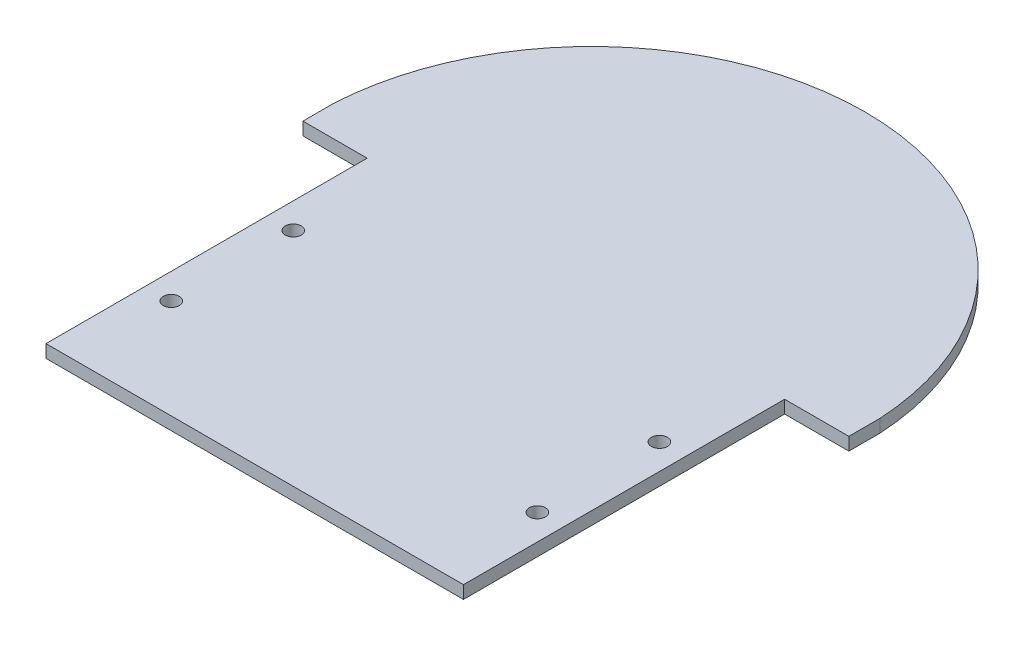
ISO-10303-21;
HEADER;
FILE_DESCRIPTION(('STEP AP214'),'2;1');
FILE_NAME('part.step','',(''),(''),'','','');
FILE_SCHEMA(('AUTOMOTIVE_DESIGN { 1 0 10303 214 1 1 1 1 }'));
ENDSEC;
DATA;
#1=APPLICATION_CONTEXT('core data for automotive mechanical design processes');
#2=APPLICATION_PROTOCOL_DEFINITION('international standard','automotive_design',2000,#1);
#3=PRODUCT_CONTEXT('',#1,'mechanical');
#4=PRODUCT('Part','Part','',(#3));
#5=PRODUCT_RELATED_PRODUCT_CATEGORY('part','',(#4));
#6=PRODUCT_DEFINITION_FORMATION('','',#4);
#7=PRODUCT_DEFINITION_CONTEXT('part definition',#1,'design');
#8=PRODUCT_DEFINITION('design','',#6,#7);
#9=PRODUCT_DEFINITION_SHAPE('','',#8);
#10=(LENGTH_UNIT() NAMED_UNIT(*) SI_UNIT(.MILLI.,.METRE.));
#11=(NAMED_UNIT(*) PLANE_ANGLE_UNIT() SI_UNIT($,.RADIAN.));
#12=(NAMED_UNIT(*) SI_UNIT($,.STERADIAN.) SOLID_ANGLE_UNIT());
#13=UNCERTAINTY_MEASURE_WITH_UNIT(LENGTH_MEASURE(1.E-05),#10,'distance_accuracy_value','');
#14=(GEOMETRIC_REPRESENTATION_CONTEXT(3) GLOBAL_UNCERTAINTY_ASSIGNED_CONTEXT((#13)) GLOBAL_UNIT_ASSIGNED_CONTEXT((#10,
#11,#12)) REPRESENTATION_CONTEXT('',''));
#15=CARTESIAN_POINT('',(0.,0.,0.));
#16=DIRECTION('',(0.,0.,1.));
#17=DIRECTION('',(1.,0.,0.));
#18=AXIS2_PLACEMENT_3D('',#15,#16,#17);
#19=CARTESIAN_POINT('',(0.,2.,-4.93055555555554));
#20=DIRECTION('',(0.,-1.,0.));
#21=DIRECTION('',(0.,0.,-1.));
#22=AXIS2_PLACEMENT_3D('',#19,#20,#21);
#23=CYLINDRICAL_SURFACE('',#22,42.5694444444444);
#24=CARTESIAN_POINT('',(0.,0.,-4.93055555555554));
#25=DIRECTION('',(0.,1.,0.));
#26=DIRECTION('',(0.,0.,1.));
#27=AXIS2_PLACEMENT_3D('',#24,#25,#26);
#28=CIRCLE('',#27,42.5694444444444);
#29=CARTESIAN_POINT('',(-42.5,0.,-7.36111111111103));
#30=VERTEX_POINT('',#29);
#31=CARTESIAN_POINT('',(42.5,0.,-7.36111111111103));
#32=VERTEX_POINT('',#31);
#33=EDGE_CURVE('E139',#30,#32,#28,.F.);
#34=ORIENTED_EDGE('',*,*,#33,.F.);
#35=DIRECTION('',(0.,-1.,0.));
#36=VECTOR('',#35,1.);
#37=CARTESIAN_POINT('',(-42.5,2.,-7.36111111111103));
#38=LINE('',#37,#36);
#39=CARTESIAN_POINT('',(-42.5,2.,-7.36111111111103));
#40=VERTEX_POINT('',#39);
#41=EDGE_CURVE('E11',#40,#30,#38,.T.);
#42=ORIENTED_EDGE('',*,*,#41,.F.);
#43=CARTESIAN_POINT('',(0.,2.,-4.93055555555554));
#44=DIRECTION('',(0.,1.,0.));
#45=DIRECTION('',(0.,0.,1.));
#46=AXIS2_PLACEMENT_3D('',#43,#44,#45);
#47=CIRCLE('',#46,42.5694444444444);
#48=CARTESIAN_POINT('',(42.5,2.,-7.36111111111103));
#49=VERTEX_POINT('',#48);
#50=EDGE_CURVE('E159',#40,#49,#47,.F.);
#51=ORIENTED_EDGE('',*,*,#50,.T.);
#52=DIRECTION('',(0.,-1.,0.));
#53=VECTOR('',#52,1.);
#54=CARTESIAN_POINT('',(42.5,2.,-7.36111111111103));
#55=LINE('',#54,#53);
#56=EDGE_CURVE('E95',#49,#32,#55,.T.);
#57=ORIENTED_EDGE('',*,*,#56,.T.);
#58=EDGE_LOOP('',(#34,#42,#51,#57));
#59=FACE_BOUND('',#58,.T.);
#60=ADVANCED_FACE('F45',(#59),#23,.T.);
#61=CARTESIAN_POINT('',(-42.5,2.,0.));
#62=DIRECTION('',(-1.,0.,0.));
#63=DIRECTION('',(0.,0.,1.));
#64=AXIS2_PLACEMENT_3D('',#61,#62,#63);
#65=PLANE('',#64);
#66=DIRECTION('',(0.,0.,-1.));
#67=VECTOR('',#66,1.);
#68=CARTESIAN_POINT('',(-42.5,0.,0.));
#69=LINE('',#68,#67);
#70=CARTESIAN_POINT('',(-42.5,0.,-2.50000000000001));
#71=VERTEX_POINT('',#70);
#72=EDGE_CURVE('E142',#71,#30,#69,.T.);
#73=ORIENTED_EDGE('',*,*,#72,.F.);
#74=DIRECTION('',(0.,-1.,0.));
#75=VECTOR('',#74,1.);
#76=CARTESIAN_POINT('',(-42.5,2.,-2.50000000000001));
#77=LINE('',#76,#75);
#78=CARTESIAN_POINT('',(-42.5,2.,-2.50000000000001));
#79=VERTEX_POINT('',#78);
#80=EDGE_CURVE('E53',#79,#71,#77,.T.);
#81=ORIENTED_EDGE('',*,*,#80,.F.);
#82=DIRECTION('',(0.,0.,-1.));
#83=VECTOR('',#82,1.);
#84=CARTESIAN_POINT('',(-42.5,2.,0.));
#85=LINE('',#84,#83);
#86=EDGE_CURVE('E181',#79,#40,#85,.T.);
#87=ORIENTED_EDGE('',*,*,#86,.T.);
#88=ORIENTED_EDGE('',*,*,#41,.T.);
#89=EDGE_LOOP('',(#73,#81,#87,#88));
#90=FACE_BOUND('',#89,.T.);
#91=ADVANCED_FACE('F180',(#90),#65,.T.);
#92=CARTESIAN_POINT('',(0.,2.,-2.50000000000001));
#93=DIRECTION('',(0.,0.,-1.));
#94=DIRECTION('',(-1.,0.,0.));
#95=AXIS2_PLACEMENT_3D('',#92,#93,#94);
#96=PLANE('',#95);
#97=DIRECTION('',(1.,0.,0.));
#98=VECTOR('',#97,1.);
#99=CARTESIAN_POINT('',(0.,0.,-2.50000000000001));
#100=LINE('',#99,#98);
#101=CARTESIAN_POINT('',(-32.5,0.,-2.50000000000001));
#102=VERTEX_POINT('',#101);
#103=EDGE_CURVE('E146',#71,#102,#100,.T.);
#104=ORIENTED_EDGE('',*,*,#103,.T.);
#105=DIRECTION('',(0.,-1.,0.));
#106=VECTOR('',#105,1.);
#107=CARTESIAN_POINT('',(-32.5,2.,-2.50000000000001));
#108=LINE('',#107,#106);
#109=CARTESIAN_POINT('',(-32.5,2.,-2.50000000000001));
#110=VERTEX_POINT('',#109);
#111=EDGE_CURVE('E165',#110,#102,#108,.T.);
#112=ORIENTED_EDGE('',*,*,#111,.F.);
#113=DIRECTION('',(1.,0.,0.));
#114=VECTOR('',#113,1.);
#115=CARTESIAN_POINT('',(0.,2.,-2.50000000000001));
#116=LINE('',#115,#114);
#117=EDGE_CURVE('E171',#79,#110,#116,.T.);
#118=ORIENTED_EDGE('',*,*,#117,.F.);
#119=ORIENTED_EDGE('',*,*,#80,.T.);
#120=EDGE_LOOP('',(#104,#112,#118,#119));
#121=FACE_BOUND('',#120,.T.);
#122=ADVANCED_FACE('F169',(#121),#96,.F.);
#123=CARTESIAN_POINT('',(-32.5,2.,0.));
#124=DIRECTION('',(-1.,0.,0.));
#125=DIRECTION('',(0.,0.,1.));
#126=AXIS2_PLACEMENT_3D('',#123,#124,#125);
#127=PLANE('',#126);
#128=DIRECTION('',(0.,0.,-1.));
#129=VECTOR('',#128,1.);
#130=CARTESIAN_POINT('',(-32.5,0.,0.));
#131=LINE('',#130,#129);
#132=CARTESIAN_POINT('',(-32.5,0.,47.5));
#133=VERTEX_POINT('',#132);
#134=EDGE_CURVE('E149',#133,#102,#131,.T.);
#135=ORIENTED_EDGE('',*,*,#134,.F.);
#136=DIRECTION('',(0.,-1.,0.));
#137=VECTOR('',#136,1.);
#138=CARTESIAN_POINT('',(-32.5,2.,47.5));
#139=LINE('',#138,#137);
#140=CARTESIAN_POINT('',(-32.5,2.,47.5));
#141=VERTEX_POINT('',#140);
#142=EDGE_CURVE('E163',#141,#133,#139,.T.);
#143=ORIENTED_EDGE('',*,*,#142,.F.);
#144=DIRECTION('',(0.,0.,-1.));
#145=VECTOR('',#144,1.);
#146=CARTESIAN_POINT('',(-32.5,2.,0.));
#147=LINE('',#146,#145);
#148=EDGE_CURVE('E190',#141,#110,#147,.T.);
#149=ORIENTED_EDGE('',*,*,#148,.T.);
#150=ORIENTED_EDGE('',*,*,#111,.T.);
#151=EDGE_LOOP('',(#135,#143,#149,#150));
#152=FACE_BOUND('',#151,.T.);
#153=ADVANCED_FACE('F193',(#152),#127,.T.);
#154=CARTESIAN_POINT('',(0.,2.,47.5));
#155=DIRECTION('',(0.,0.,-1.));
#156=DIRECTION('',(-1.,0.,0.));
#157=AXIS2_PLACEMENT_3D('',#154,#155,#156);
#158=PLANE('',#157);
#159=DIRECTION('',(1.,0.,0.));
#160=VECTOR('',#159,1.);
#161=CARTESIAN_POINT('',(0.,0.,47.5));
#162=LINE('',#161,#160);
#163=CARTESIAN_POINT('',(32.5,0.,47.5));
#164=VERTEX_POINT('',#163);
#165=EDGE_CURVE('E152',#133,#164,#162,.T.);
#166=ORIENTED_EDGE('',*,*,#165,.T.);
#167=DIRECTION('',(0.,-1.,0.));
#168=VECTOR('',#167,1.);
#169=CARTESIAN_POINT('',(32.5,2.,47.5));
#170=LINE('',#169,#168);
#171=CARTESIAN_POINT('',(32.5,2.,47.5));
#172=VERTEX_POINT('',#171);
#173=EDGE_CURVE('E132',#172,#164,#170,.T.);
#174=ORIENTED_EDGE('',*,*,#173,.F.);
#175=DIRECTION('',(1.,0.,0.));
#176=VECTOR('',#175,1.);
#177=CARTESIAN_POINT('',(0.,2.,47.5));
#178=LINE('',#177,#176);
#179=EDGE_CURVE('E119',#141,#172,#178,.T.);
#180=ORIENTED_EDGE('',*,*,#179,.F.);
#181=ORIENTED_EDGE('',*,*,#142,.T.);
#182=EDGE_LOOP('',(#166,#174,#180,#181));
#183=FACE_BOUND('',#182,.T.);
#184=ADVANCED_FACE('F195',(#183),#158,.F.);
#185=CARTESIAN_POINT('',(32.5,2.,0.));
#186=DIRECTION('',(-1.,0.,0.));
#187=DIRECTION('',(0.,0.,1.));
#188=AXIS2_PLACEMENT_3D('',#185,#186,#187);
#189=PLANE('',#188);
#190=DIRECTION('',(0.,0.,-1.));
#191=VECTOR('',#190,1.);
#192=CARTESIAN_POINT('',(32.5,0.,0.));
#193=LINE('',#192,#191);
#194=CARTESIAN_POINT('',(32.5,0.,-2.50000000000001));
#195=VERTEX_POINT('',#194);
#196=EDGE_CURVE('E128',#164,#195,#193,.T.);
#197=ORIENTED_EDGE('',*,*,#196,.T.);
#198=DIRECTION('',(0.,-1.,0.));
#199=VECTOR('',#198,1.);
#200=CARTESIAN_POINT('',(32.5,2.,-2.50000000000001));
#201=LINE('',#200,#199);
#202=CARTESIAN_POINT('',(32.5,2.,-2.50000000000001));
#203=VERTEX_POINT('',#202);
#204=EDGE_CURVE('E125',#203,#195,#201,.T.);
#205=ORIENTED_EDGE('',*,*,#204,.F.);
#206=DIRECTION('',(0.,0.,-1.));
#207=VECTOR('',#206,1.);
#208=CARTESIAN_POINT('',(32.5,2.,0.));
#209=LINE('',#208,#207);
#210=EDGE_CURVE('E112',#172,#203,#209,.T.);
#211=ORIENTED_EDGE('',*,*,#210,.F.);
#212=ORIENTED_EDGE('',*,*,#173,.T.);
#213=EDGE_LOOP('',(#197,#205,#211,#212));
#214=FACE_BOUND('',#213,.T.);
#215=ADVANCED_FACE('F126',(#214),#189,.F.);
#216=CARTESIAN_POINT('',(0.,2.,-2.50000000000001));
#217=DIRECTION('',(0.,0.,1.));
#218=DIRECTION('',(1.,0.,0.));
#219=AXIS2_PLACEMENT_3D('',#216,#217,#218);
#220=PLANE('',#219);
#221=DIRECTION('',(-1.,0.,0.));
#222=VECTOR('',#221,1.);
#223=CARTESIAN_POINT('',(0.,0.,-2.50000000000001));
#224=LINE('',#223,#222);
#225=CARTESIAN_POINT('',(42.5,0.,-2.50000000000001));
#226=VERTEX_POINT('',#225);
#227=EDGE_CURVE('E155',#226,#195,#224,.T.);
#228=ORIENTED_EDGE('',*,*,#227,.F.);
#229=DIRECTION('',(0.,-1.,0.));
#230=VECTOR('',#229,1.);
#231=CARTESIAN_POINT('',(42.5,2.,-2.50000000000001));
#232=LINE('',#231,#230);
#233=CARTESIAN_POINT('',(42.5,2.,-2.50000000000001));
#234=VERTEX_POINT('',#233);
#235=EDGE_CURVE('E88',#234,#226,#232,.T.);
#236=ORIENTED_EDGE('',*,*,#235,.F.);
#237=DIRECTION('',(-1.,0.,0.));
#238=VECTOR('',#237,1.);
#239=CARTESIAN_POINT('',(0.,2.,-2.50000000000001));
#240=LINE('',#239,#238);
#241=EDGE_CURVE('E116',#234,#203,#240,.T.);
#242=ORIENTED_EDGE('',*,*,#241,.T.);
#243=ORIENTED_EDGE('',*,*,#204,.T.);
#244=EDGE_LOOP('',(#228,#236,#242,#243));
#245=FACE_BOUND('',#244,.T.);
#246=ADVANCED_FACE('F134',(#245),#220,.T.);
#247=CARTESIAN_POINT('',(42.5,2.,0.));
#248=DIRECTION('',(-1.,0.,0.));
#249=DIRECTION('',(0.,0.,1.));
#250=AXIS2_PLACEMENT_3D('',#247,#248,#249);
#251=PLANE('',#250);
#252=DIRECTION('',(0.,0.,-1.));
#253=VECTOR('',#252,1.);
#254=CARTESIAN_POINT('',(42.5,0.,0.));
#255=LINE('',#254,#253);
#256=EDGE_CURVE('E157',#226,#32,#255,.T.);
#257=ORIENTED_EDGE('',*,*,#256,.T.);
#258=ORIENTED_EDGE('',*,*,#56,.F.);
#259=DIRECTION('',(0.,0.,-1.));
#260=VECTOR('',#259,1.);
#261=CARTESIAN_POINT('',(42.5,2.,0.));
#262=LINE('',#261,#260);
#263=EDGE_CURVE('E61',#234,#49,#262,.T.);
#264=ORIENTED_EDGE('',*,*,#263,.F.);
#265=ORIENTED_EDGE('',*,*,#235,.T.);
#266=EDGE_LOOP('',(#257,#258,#264,#265));
#267=FACE_BOUND('',#266,.T.);
#268=ADVANCED_FACE('F182',(#267),#251,.F.);
#269=CARTESIAN_POINT('',(0.,2.,0.));
#270=DIRECTION('',(0.,1.,0.));
#271=DIRECTION('',(0.,0.,1.));
#272=AXIS2_PLACEMENT_3D('',#269,#270,#271);
#273=PLANE('',#272);
#274=CARTESIAN_POINT('',(28.5,2.,13.));
#275=DIRECTION('',(0.,1.,0.));
#276=DIRECTION('',(0.,0.,-1.));
#277=AXIS2_PLACEMENT_3D('',#274,#275,#276);
#278=CIRCLE('',#277,1.25);
#279=CARTESIAN_POINT('',(28.5,2.,11.75));
#280=VERTEX_POINT('',#279);
#281=EDGE_CURVE('E375',#280,#280,#278,.T.);
#282=ORIENTED_EDGE('',*,*,#281,.F.);
#283=EDGE_LOOP('',(#282));
#284=FACE_BOUND('',#283,.T.);
#285=CARTESIAN_POINT('',(28.5,2.,32.));
#286=DIRECTION('',(0.,1.,0.));
#287=DIRECTION('',(0.,0.,1.));
#288=AXIS2_PLACEMENT_3D('',#285,#286,#287);
#289=CIRCLE('',#288,1.25);
#290=CARTESIAN_POINT('',(28.5,2.,33.25));
#291=VERTEX_POINT('',#290);
#292=EDGE_CURVE('E379',#291,#291,#289,.T.);
#293=ORIENTED_EDGE('',*,*,#292,.F.);
#294=EDGE_LOOP('',(#293));
#295=FACE_BOUND('',#294,.T.);
#296=CARTESIAN_POINT('',(-28.5,2.,32.));
#297=DIRECTION('',(0.,1.,0.));
#298=DIRECTION('',(0.,0.,-1.));
#299=AXIS2_PLACEMENT_3D('',#296,#297,#298);
#300=CIRCLE('',#299,1.25);
#301=CARTESIAN_POINT('',(-28.5,2.,30.75));
#302=VERTEX_POINT('',#301);
#303=EDGE_CURVE('E393',#302,#302,#300,.T.);
#304=ORIENTED_EDGE('',*,*,#303,.F.);
#305=EDGE_LOOP('',(#304));
#306=FACE_BOUND('',#305,.T.);
#307=CARTESIAN_POINT('',(-28.5,2.,13.));
#308=DIRECTION('',(0.,1.,0.));
#309=DIRECTION('',(0.,0.,1.));
#310=AXIS2_PLACEMENT_3D('',#307,#308,#309);
#311=CIRCLE('',#310,1.25);
#312=CARTESIAN_POINT('',(-28.5,2.,14.25));
#313=VERTEX_POINT('',#312);
#314=EDGE_CURVE('E143',#313,#313,#311,.T.);
#315=ORIENTED_EDGE('',*,*,#314,.F.);
#316=EDGE_LOOP('',(#315));
#317=FACE_BOUND('',#316,.T.);
#318=ORIENTED_EDGE('',*,*,#50,.F.);
#319=ORIENTED_EDGE('',*,*,#86,.F.);
#320=ORIENTED_EDGE('',*,*,#117,.T.);
#321=ORIENTED_EDGE('',*,*,#148,.F.);
#322=ORIENTED_EDGE('',*,*,#179,.T.);
#323=ORIENTED_EDGE('',*,*,#210,.T.);
#324=ORIENTED_EDGE('',*,*,#241,.F.);
#325=ORIENTED_EDGE('',*,*,#263,.T.);
#326=EDGE_LOOP('',(#318,#319,#320,#321,#322,#323,#324,#325));
#327=FACE_BOUND('',#326,.T.);
#328=ADVANCED_FACE('F114',(#284,#295,#306,#317,#327),#273,.T.);
#329=CARTESIAN_POINT('',(0.,0.,0.));
#330=DIRECTION('',(0.,1.,0.));
#331=DIRECTION('',(0.,0.,1.));
#332=AXIS2_PLACEMENT_3D('',#329,#330,#331);
#333=PLANE('',#332);
#334=CARTESIAN_POINT('',(28.5,0.,13.));
#335=DIRECTION('',(0.,1.,0.));
#336=DIRECTION('',(0.,0.,-1.));
#337=AXIS2_PLACEMENT_3D('',#334,#335,#336);
#338=CIRCLE('',#337,1.25);
#339=CARTESIAN_POINT('',(28.5,0.,11.75));
#340=VERTEX_POINT('',#339);
#341=EDGE_CURVE('E378',#340,#340,#338,.T.);
#342=ORIENTED_EDGE('',*,*,#341,.T.);
#343=EDGE_LOOP('',(#342));
#344=FACE_BOUND('',#343,.T.);
#345=CARTESIAN_POINT('',(28.5,0.,32.));
#346=DIRECTION('',(0.,1.,0.));
#347=DIRECTION('',(0.,0.,1.));
#348=AXIS2_PLACEMENT_3D('',#345,#346,#347);
#349=CIRCLE('',#348,1.25);
#350=CARTESIAN_POINT('',(28.5,0.,33.25));
#351=VERTEX_POINT('',#350);
#352=EDGE_CURVE('E382',#351,#351,#349,.T.);
#353=ORIENTED_EDGE('',*,*,#352,.T.);
#354=EDGE_LOOP('',(#353));
#355=FACE_BOUND('',#354,.T.);
#356=CARTESIAN_POINT('',(-28.5,0.,32.));
#357=DIRECTION('',(0.,1.,0.));
#358=DIRECTION('',(0.,0.,-1.));
#359=AXIS2_PLACEMENT_3D('',#356,#357,#358);
#360=CIRCLE('',#359,1.25);
#361=CARTESIAN_POINT('',(-28.5,0.,30.75));
#362=VERTEX_POINT('',#361);
#363=EDGE_CURVE('E389',#362,#362,#360,.T.);
#364=ORIENTED_EDGE('',*,*,#363,.T.);
#365=EDGE_LOOP('',(#364));
#366=FACE_BOUND('',#365,.T.);
#367=CARTESIAN_POINT('',(-28.5,0.,13.));
#368=DIRECTION('',(0.,1.,0.));
#369=DIRECTION('',(0.,0.,1.));
#370=AXIS2_PLACEMENT_3D('',#367,#368,#369);
#371=CIRCLE('',#370,1.25);
#372=CARTESIAN_POINT('',(-28.5,0.,14.25));
#373=VERTEX_POINT('',#372);
#374=EDGE_CURVE('E186',#373,#373,#371,.T.);
#375=ORIENTED_EDGE('',*,*,#374,.T.);
#376=EDGE_LOOP('',(#375));
#377=FACE_BOUND('',#376,.T.);
#378=ORIENTED_EDGE('',*,*,#33,.T.);
#379=ORIENTED_EDGE('',*,*,#256,.F.);
#380=ORIENTED_EDGE('',*,*,#227,.T.);
#381=ORIENTED_EDGE('',*,*,#196,.F.);
#382=ORIENTED_EDGE('',*,*,#165,.F.);
#383=ORIENTED_EDGE('',*,*,#134,.T.);
#384=ORIENTED_EDGE('',*,*,#103,.F.);
#385=ORIENTED_EDGE('',*,*,#72,.T.);
#386=EDGE_LOOP('',(#378,#379,#380,#381,#382,#383,#384,#385));
#387=FACE_BOUND('',#386,.T.);
#388=ADVANCED_FACE('F177',(#344,#355,#366,#377,#387),#333,.F.);
#389=CARTESIAN_POINT('',(-28.5,2.,13.));
#390=DIRECTION('',(0.,-1.,0.));
#391=DIRECTION('',(0.,0.,-1.));
#392=AXIS2_PLACEMENT_3D('',#389,#390,#391);
#393=CYLINDRICAL_SURFACE('',#392,1.25);
#394=ORIENTED_EDGE('',*,*,#314,.T.);
#395=EDGE_LOOP('',(#394));
#396=FACE_BOUND('',#395,.T.);
#397=ORIENTED_EDGE('',*,*,#374,.F.);
#398=EDGE_LOOP('',(#397));
#399=FACE_BOUND('',#398,.T.);
#400=ADVANCED_FACE('F262',(#396,#399),#393,.F.);
#401=CARTESIAN_POINT('',(-28.5,2.,32.));
#402=DIRECTION('',(0.,-1.,0.));
#403=DIRECTION('',(0.,0.,-1.));
#404=AXIS2_PLACEMENT_3D('',#401,#402,#403);
#405=CYLINDRICAL_SURFACE('',#404,1.25);
#406=ORIENTED_EDGE('',*,*,#303,.T.);
#407=EDGE_LOOP('',(#406));
#408=FACE_BOUND('',#407,.T.);
#409=ORIENTED_EDGE('',*,*,#363,.F.);
#410=EDGE_LOOP('',(#409));
#411=FACE_BOUND('',#410,.T.);
#412=ADVANCED_FACE('F272',(#408,#411),#405,.F.);
#413=CARTESIAN_POINT('',(28.5,2.,32.));
#414=DIRECTION('',(0.,-1.,0.));
#415=DIRECTION('',(0.,0.,-1.));
#416=AXIS2_PLACEMENT_3D('',#413,#414,#415);
#417=CYLINDRICAL_SURFACE('',#416,1.25);
#418=ORIENTED_EDGE('',*,*,#292,.T.);
#419=EDGE_LOOP('',(#418));
#420=FACE_BOUND('',#419,.T.);
#421=ORIENTED_EDGE('',*,*,#352,.F.);
#422=EDGE_LOOP('',(#421));
#423=FACE_BOUND('',#422,.T.);
#424=ADVANCED_FACE('F282',(#420,#423),#417,.F.);
#425=CARTESIAN_POINT('',(28.5,2.,13.));
#426=DIRECTION('',(0.,-1.,0.));
#427=DIRECTION('',(0.,0.,-1.));
#428=AXIS2_PLACEMENT_3D('',#425,#426,#427);
#429=CYLINDRICAL_SURFACE('',#428,1.25);
#430=ORIENTED_EDGE('',*,*,#281,.T.);
#431=EDGE_LOOP('',(#430));
#432=FACE_BOUND('',#431,.T.);
#433=ORIENTED_EDGE('',*,*,#341,.F.);
#434=EDGE_LOOP('',(#433));
#435=FACE_BOUND('',#434,.T.);
#436=ADVANCED_FACE('F292',(#432,#435),#429,.F.);
#437=CLOSED_SHELL('',(#60,#91,#122,#153,#184,#215,#246,#268,#328,#388,#400,#412,#424,#436));
#438=MANIFOLD_SOLID_BREP('B2',#437);
#439=ADVANCED_BREP_SHAPE_REPRESENTATION('',(#18,#438),#14);
#440=SHAPE_DEFINITION_REPRESENTATION(#9,#439);
ENDSEC;
END-ISO-10303-21;
